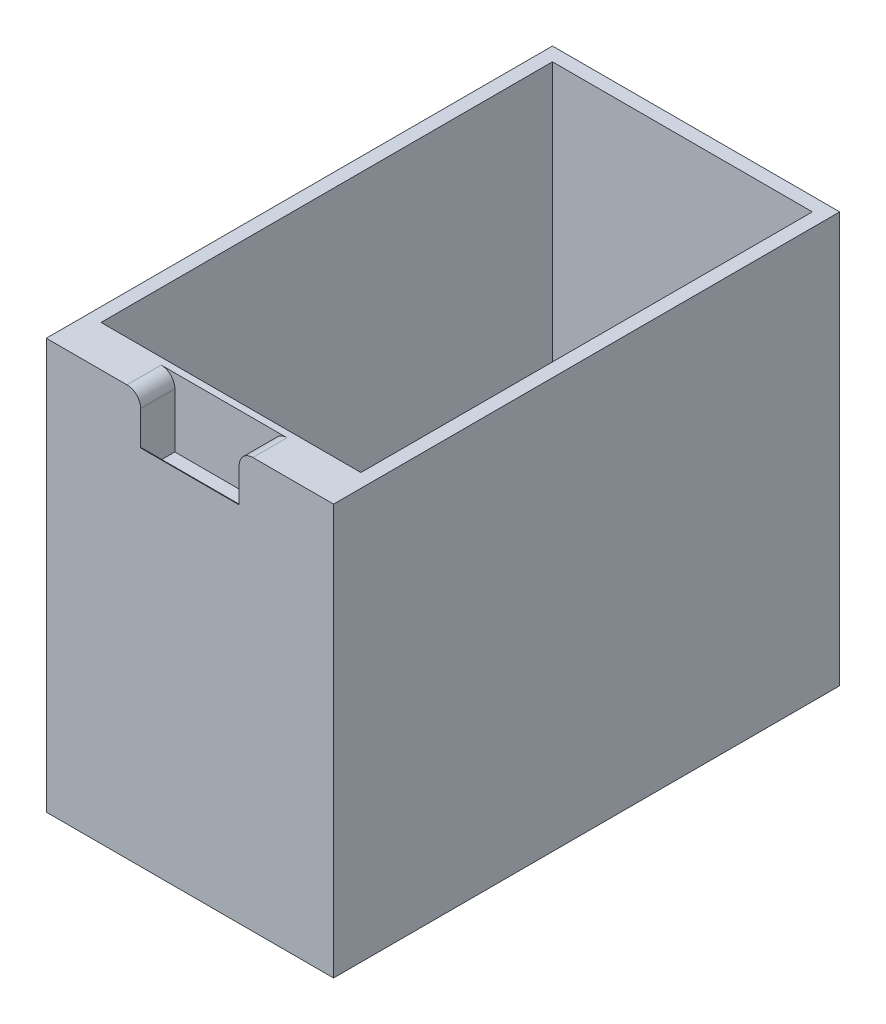
ISO-10303-21;
HEADER;
FILE_DESCRIPTION(('STEP AP214'),'2;1');
FILE_NAME('part.step','',(''),(''),'','','');
FILE_SCHEMA(('AUTOMOTIVE_DESIGN { 1 0 10303 214 1 1 1 1 }'));
ENDSEC;
DATA;
#1=APPLICATION_CONTEXT('core data for automotive mechanical design processes');
#2=APPLICATION_PROTOCOL_DEFINITION('international standard','automotive_design',2000,#1);
#3=PRODUCT_CONTEXT('',#1,'mechanical');
#4=PRODUCT('Part','Part','',(#3));
#5=PRODUCT_RELATED_PRODUCT_CATEGORY('part','',(#4));
#6=PRODUCT_DEFINITION_FORMATION('','',#4);
#7=PRODUCT_DEFINITION_CONTEXT('part definition',#1,'design');
#8=PRODUCT_DEFINITION('design','',#6,#7);
#9=PRODUCT_DEFINITION_SHAPE('','',#8);
#10=(LENGTH_UNIT() NAMED_UNIT(*) SI_UNIT(.MILLI.,.METRE.));
#11=(NAMED_UNIT(*) PLANE_ANGLE_UNIT() SI_UNIT($,.RADIAN.));
#12=(NAMED_UNIT(*) SI_UNIT($,.STERADIAN.) SOLID_ANGLE_UNIT());
#13=UNCERTAINTY_MEASURE_WITH_UNIT(LENGTH_MEASURE(1.E-05),#10,'distance_accuracy_value','');
#14=(GEOMETRIC_REPRESENTATION_CONTEXT(3) GLOBAL_UNCERTAINTY_ASSIGNED_CONTEXT((#13)) GLOBAL_UNIT_ASSIGNED_CONTEXT((#10,
#11,#12)) REPRESENTATION_CONTEXT('',''));
#15=CARTESIAN_POINT('',(0.,0.,0.));
#16=DIRECTION('',(0.,0.,1.));
#17=DIRECTION('',(1.,0.,0.));
#18=AXIS2_PLACEMENT_3D('',#15,#16,#17);
#19=CARTESIAN_POINT('',(-113.883179231863,42.5526315789474,-370.));
#20=DIRECTION('',(-1.,0.,0.));
#21=DIRECTION('',(0.,-1.,0.));
#22=AXIS2_PLACEMENT_3D('',#19,#20,#21);
#23=PLANE('',#22);
#24=DIRECTION('',(0.,-1.,0.));
#25=VECTOR('',#24,1.);
#26=CARTESIAN_POINT('',(-113.883179231863,42.5526315789474,0.));
#27=LINE('',#26,#25);
#28=CARTESIAN_POINT('',(-113.883179231863,42.5526315789474,0.));
#29=VERTEX_POINT('',#28);
#30=CARTESIAN_POINT('',(-113.883179231863,-257.447368421053,0.));
#31=VERTEX_POINT('',#30);
#32=EDGE_CURVE('E215',#29,#31,#27,.T.);
#33=ORIENTED_EDGE('',*,*,#32,.F.);
#34=DIRECTION('',(0.,0.,1.));
#35=VECTOR('',#34,1.);
#36=CARTESIAN_POINT('',(-113.883179231863,42.5526315789474,-370.));
#37=LINE('',#36,#35);
#38=CARTESIAN_POINT('',(-113.883179231863,42.5526315789474,-370.));
#39=VERTEX_POINT('',#38);
#40=EDGE_CURVE('E247',#39,#29,#37,.T.);
#41=ORIENTED_EDGE('',*,*,#40,.F.);
#42=DIRECTION('',(0.,-1.,0.));
#43=VECTOR('',#42,1.);
#44=CARTESIAN_POINT('',(-113.883179231863,42.5526315789474,-370.));
#45=LINE('',#44,#43);
#46=CARTESIAN_POINT('',(-113.883179231863,-257.447368421053,-370.));
#47=VERTEX_POINT('',#46);
#48=EDGE_CURVE('E222',#39,#47,#45,.T.);
#49=ORIENTED_EDGE('',*,*,#48,.T.);
#50=DIRECTION('',(0.,0.,1.));
#51=VECTOR('',#50,1.);
#52=CARTESIAN_POINT('',(-113.883179231863,-257.447368421053,-370.));
#53=LINE('',#52,#51);
#54=EDGE_CURVE('E235',#47,#31,#53,.T.);
#55=ORIENTED_EDGE('',*,*,#54,.T.);
#56=EDGE_LOOP('',(#33,#41,#49,#55));
#57=FACE_BOUND('',#56,.T.);
#58=ADVANCED_FACE('F33',(#57),#23,.T.);
#59=CARTESIAN_POINT('',(-113.883179231863,42.5526315789474,-370.));
#60=DIRECTION('',(0.,1.,0.));
#61=DIRECTION('',(0.,0.,1.));
#62=AXIS2_PLACEMENT_3D('',#59,#60,#61);
#63=PLANE('',#62);
#64=DIRECTION('',(-1.,0.,0.));
#65=VECTOR('',#64,1.);
#66=CARTESIAN_POINT('',(-113.883179231863,42.5526315789474,0.));
#67=LINE('',#66,#65);
#68=CARTESIAN_POINT('',(-54.8831792318634,42.5526315789474,0.));
#69=VERTEX_POINT('',#68);
#70=EDGE_CURVE('E244',#69,#29,#67,.T.);
#71=ORIENTED_EDGE('',*,*,#70,.F.);
#72=DIRECTION('',(0.,0.,1.));
#73=VECTOR('',#72,1.);
#74=CARTESIAN_POINT('',(-54.8831792318634,42.5526315789474,-25.));
#75=LINE('',#74,#73);
#76=CARTESIAN_POINT('',(-54.8831792318634,42.5526315789474,-25.));
#77=VERTEX_POINT('',#76);
#78=EDGE_CURVE('E267',#69,#77,#75,.F.);
#79=ORIENTED_EDGE('',*,*,#78,.T.);
#80=DIRECTION('',(-1.,0.,0.));
#81=VECTOR('',#80,1.);
#82=CARTESIAN_POINT('',(27.1168207681366,42.5526315789474,-25.));
#83=LINE('',#82,#81);
#84=CARTESIAN_POINT('',(37.1168207681366,42.5526315789474,-25.));
#85=VERTEX_POINT('',#84);
#86=EDGE_CURVE('E179',#85,#77,#83,.T.);
#87=ORIENTED_EDGE('',*,*,#86,.F.);
#88=DIRECTION('',(0.,0.,-1.));
#89=VECTOR('',#88,1.);
#90=CARTESIAN_POINT('',(37.1168207681366,42.5526315789474,0.));
#91=LINE('',#90,#89);
#92=CARTESIAN_POINT('',(37.1168207681366,42.5526315789474,0.));
#93=VERTEX_POINT('',#92);
#94=EDGE_CURVE('E256',#85,#93,#91,.F.);
#95=ORIENTED_EDGE('',*,*,#94,.T.);
#96=CARTESIAN_POINT('',(96.1168207681366,42.5526315789474,0.));
#97=VERTEX_POINT('',#96);
#98=EDGE_CURVE('E226',#97,#93,#67,.T.);
#99=ORIENTED_EDGE('',*,*,#98,.F.);
#100=DIRECTION('',(0.,0.,1.));
#101=VECTOR('',#100,1.);
#102=CARTESIAN_POINT('',(96.1168207681366,42.5526315789474,-370.));
#103=LINE('',#102,#101);
#104=CARTESIAN_POINT('',(96.1168207681366,42.5526315789474,-370.));
#105=VERTEX_POINT('',#104);
#106=EDGE_CURVE('E250',#105,#97,#103,.T.);
#107=ORIENTED_EDGE('',*,*,#106,.F.);
#108=DIRECTION('',(-1.,0.,0.));
#109=VECTOR('',#108,1.);
#110=CARTESIAN_POINT('',(-113.883179231863,42.5526315789474,-370.));
#111=LINE('',#110,#109);
#112=EDGE_CURVE('E232',#105,#39,#111,.T.);
#113=ORIENTED_EDGE('',*,*,#112,.T.);
#114=ORIENTED_EDGE('',*,*,#40,.T.);
#115=EDGE_LOOP('',(#71,#79,#87,#95,#99,#107,#113,#114));
#116=FACE_BOUND('',#115,.T.);
#117=DIRECTION('',(0.,0.,1.));
#118=VECTOR('',#117,1.);
#119=CARTESIAN_POINT('',(-103.883179231863,42.5526315789474,-360.));
#120=LINE('',#119,#118);
#121=CARTESIAN_POINT('',(-103.883179231863,42.5526315789474,-360.));
#122=VERTEX_POINT('',#121);
#123=CARTESIAN_POINT('',(-103.883179231863,42.5526315789474,-30.));
#124=VERTEX_POINT('',#123);
#125=EDGE_CURVE('E185',#122,#124,#120,.T.);
#126=ORIENTED_EDGE('',*,*,#125,.F.);
#127=DIRECTION('',(-1.,0.,0.));
#128=VECTOR('',#127,1.);
#129=CARTESIAN_POINT('',(-103.883179231863,42.5526315789474,-360.));
#130=LINE('',#129,#128);
#131=CARTESIAN_POINT('',(86.1168207681366,42.5526315789474,-360.));
#132=VERTEX_POINT('',#131);
#133=EDGE_CURVE('E194',#132,#122,#130,.T.);
#134=ORIENTED_EDGE('',*,*,#133,.F.);
#135=DIRECTION('',(0.,0.,-1.));
#136=VECTOR('',#135,1.);
#137=CARTESIAN_POINT('',(86.1168207681366,42.5526315789474,-360.));
#138=LINE('',#137,#136);
#139=CARTESIAN_POINT('',(86.1168207681366,42.5526315789474,-30.));
#140=VERTEX_POINT('',#139);
#141=EDGE_CURVE('E208',#140,#132,#138,.T.);
#142=ORIENTED_EDGE('',*,*,#141,.F.);
#143=DIRECTION('',(1.,0.,0.));
#144=VECTOR('',#143,1.);
#145=CARTESIAN_POINT('',(-103.883179231863,42.5526315789474,-30.));
#146=LINE('',#145,#144);
#147=EDGE_CURVE('E205',#124,#140,#146,.T.);
#148=ORIENTED_EDGE('',*,*,#147,.F.);
#149=EDGE_LOOP('',(#126,#134,#142,#148));
#150=FACE_BOUND('',#149,.T.);
#151=ADVANCED_FACE('F288',(#116,#150),#63,.T.);
#152=CARTESIAN_POINT('',(96.1168207681366,42.5526315789474,-370.));
#153=DIRECTION('',(1.,0.,0.));
#154=DIRECTION('',(0.,1.,0.));
#155=AXIS2_PLACEMENT_3D('',#152,#153,#154);
#156=PLANE('',#155);
#157=DIRECTION('',(0.,1.,0.));
#158=VECTOR('',#157,1.);
#159=CARTESIAN_POINT('',(96.1168207681366,42.5526315789474,0.));
#160=LINE('',#159,#158);
#161=CARTESIAN_POINT('',(96.1168207681366,-257.447368421053,0.));
#162=VERTEX_POINT('',#161);
#163=EDGE_CURVE('E241',#162,#97,#160,.T.);
#164=ORIENTED_EDGE('',*,*,#163,.F.);
#165=DIRECTION('',(0.,0.,1.));
#166=VECTOR('',#165,1.);
#167=CARTESIAN_POINT('',(96.1168207681366,-257.447368421053,-370.));
#168=LINE('',#167,#166);
#169=CARTESIAN_POINT('',(96.1168207681366,-257.447368421053,-370.));
#170=VERTEX_POINT('',#169);
#171=EDGE_CURVE('E252',#170,#162,#168,.T.);
#172=ORIENTED_EDGE('',*,*,#171,.F.);
#173=DIRECTION('',(0.,1.,0.));
#174=VECTOR('',#173,1.);
#175=CARTESIAN_POINT('',(96.1168207681366,42.5526315789474,-370.));
#176=LINE('',#175,#174);
#177=EDGE_CURVE('E229',#170,#105,#176,.T.);
#178=ORIENTED_EDGE('',*,*,#177,.T.);
#179=ORIENTED_EDGE('',*,*,#106,.T.);
#180=EDGE_LOOP('',(#164,#172,#178,#179));
#181=FACE_BOUND('',#180,.T.);
#182=ADVANCED_FACE('F302',(#181),#156,.T.);
#183=CARTESIAN_POINT('',(-113.883179231863,-257.447368421053,-370.));
#184=DIRECTION('',(0.,-1.,0.));
#185=DIRECTION('',(0.,0.,-1.));
#186=AXIS2_PLACEMENT_3D('',#183,#184,#185);
#187=PLANE('',#186);
#188=DIRECTION('',(1.,0.,0.));
#189=VECTOR('',#188,1.);
#190=CARTESIAN_POINT('',(-113.883179231863,-257.447368421053,0.));
#191=LINE('',#190,#189);
#192=EDGE_CURVE('E238',#31,#162,#191,.T.);
#193=ORIENTED_EDGE('',*,*,#192,.F.);
#194=ORIENTED_EDGE('',*,*,#54,.F.);
#195=DIRECTION('',(1.,0.,0.));
#196=VECTOR('',#195,1.);
#197=CARTESIAN_POINT('',(-113.883179231863,-257.447368421053,-370.));
#198=LINE('',#197,#196);
#199=EDGE_CURVE('E225',#47,#170,#198,.T.);
#200=ORIENTED_EDGE('',*,*,#199,.T.);
#201=ORIENTED_EDGE('',*,*,#171,.T.);
#202=EDGE_LOOP('',(#193,#194,#200,#201));
#203=FACE_BOUND('',#202,.T.);
#204=ADVANCED_FACE('F298',(#203),#187,.T.);
#205=CARTESIAN_POINT('',(0.,0.,-370.));
#206=DIRECTION('',(0.,0.,1.));
#207=DIRECTION('',(1.,0.,0.));
#208=AXIS2_PLACEMENT_3D('',#205,#206,#207);
#209=PLANE('',#208);
#210=ORIENTED_EDGE('',*,*,#48,.F.);
#211=ORIENTED_EDGE('',*,*,#112,.F.);
#212=ORIENTED_EDGE('',*,*,#177,.F.);
#213=ORIENTED_EDGE('',*,*,#199,.F.);
#214=EDGE_LOOP('',(#210,#211,#212,#213));
#215=FACE_BOUND('',#214,.T.);
#216=ADVANCED_FACE('F322',(#215),#209,.F.);
#217=CARTESIAN_POINT('',(0.,0.,0.));
#218=DIRECTION('',(0.,0.,1.));
#219=DIRECTION('',(1.,0.,0.));
#220=AXIS2_PLACEMENT_3D('',#217,#218,#219);
#221=PLANE('',#220);
#222=DIRECTION('',(0.,1.,0.));
#223=VECTOR('',#222,1.);
#224=CARTESIAN_POINT('',(-44.8831792318634,7.55263157894735,0.));
#225=LINE('',#224,#223);
#226=CARTESIAN_POINT('',(-44.8831792318634,7.55263157894735,0.));
#227=VERTEX_POINT('',#226);
#228=CARTESIAN_POINT('',(-44.8831792318634,32.5526315789474,0.));
#229=VERTEX_POINT('',#228);
#230=EDGE_CURVE('E186',#227,#229,#225,.T.);
#231=ORIENTED_EDGE('',*,*,#230,.T.);
#232=CARTESIAN_POINT('',(-54.8831792318634,32.5526315789474,0.));
#233=DIRECTION('',(0.,0.,1.));
#234=DIRECTION('',(1.,0.,0.));
#235=AXIS2_PLACEMENT_3D('',#232,#233,#234);
#236=CIRCLE('',#235,10.);
#237=EDGE_CURVE('E265',#229,#69,#236,.T.);
#238=ORIENTED_EDGE('',*,*,#237,.T.);
#239=ORIENTED_EDGE('',*,*,#70,.T.);
#240=ORIENTED_EDGE('',*,*,#32,.T.);
#241=ORIENTED_EDGE('',*,*,#192,.T.);
#242=ORIENTED_EDGE('',*,*,#163,.T.);
#243=ORIENTED_EDGE('',*,*,#98,.T.);
#244=CARTESIAN_POINT('',(37.1168207681366,32.5526315789474,0.));
#245=DIRECTION('',(0.,0.,1.));
#246=DIRECTION('',(1.,0.,0.));
#247=AXIS2_PLACEMENT_3D('',#244,#245,#246);
#248=CIRCLE('',#247,10.);
#249=CARTESIAN_POINT('',(27.1168207681366,32.5526315789474,0.));
#250=VERTEX_POINT('',#249);
#251=EDGE_CURVE('E258',#93,#250,#248,.T.);
#252=ORIENTED_EDGE('',*,*,#251,.T.);
#253=DIRECTION('',(0.,1.,0.));
#254=VECTOR('',#253,1.);
#255=CARTESIAN_POINT('',(27.1168207681366,7.55263157894735,0.));
#256=LINE('',#255,#254);
#257=CARTESIAN_POINT('',(27.1168207681366,7.55263157894735,0.));
#258=VERTEX_POINT('',#257);
#259=EDGE_CURVE('E183',#258,#250,#256,.T.);
#260=ORIENTED_EDGE('',*,*,#259,.F.);
#261=DIRECTION('',(1.,0.,0.));
#262=VECTOR('',#261,1.);
#263=CARTESIAN_POINT('',(27.1168207681366,7.55263157894735,0.));
#264=LINE('',#263,#262);
#265=EDGE_CURVE('E158',#227,#258,#264,.T.);
#266=ORIENTED_EDGE('',*,*,#265,.F.);
#267=EDGE_LOOP('',(#231,#238,#239,#240,#241,#242,#243,#252,#260,#266));
#268=FACE_BOUND('',#267,.T.);
#269=ADVANCED_FACE('F276',(#268),#221,.T.);
#270=CARTESIAN_POINT('',(-103.883179231863,-237.447368421053,-360.));
#271=DIRECTION('',(-1.,0.,0.));
#272=DIRECTION('',(0.,0.,1.));
#273=AXIS2_PLACEMENT_3D('',#270,#271,#272);
#274=PLANE('',#273);
#275=ORIENTED_EDGE('',*,*,#125,.T.);
#276=DIRECTION('',(0.,1.,0.));
#277=VECTOR('',#276,1.);
#278=CARTESIAN_POINT('',(-103.883179231863,-237.447368421053,-30.));
#279=LINE('',#278,#277);
#280=CARTESIAN_POINT('',(-103.883179231863,-237.447368421053,-30.));
#281=VERTEX_POINT('',#280);
#282=EDGE_CURVE('E203',#281,#124,#279,.T.);
#283=ORIENTED_EDGE('',*,*,#282,.F.);
#284=DIRECTION('',(0.,0.,1.));
#285=VECTOR('',#284,1.);
#286=CARTESIAN_POINT('',(-103.883179231863,-237.447368421053,-360.));
#287=LINE('',#286,#285);
#288=CARTESIAN_POINT('',(-103.883179231863,-237.447368421053,-360.));
#289=VERTEX_POINT('',#288);
#290=EDGE_CURVE('E190',#289,#281,#287,.T.);
#291=ORIENTED_EDGE('',*,*,#290,.F.);
#292=DIRECTION('',(0.,1.,0.));
#293=VECTOR('',#292,1.);
#294=CARTESIAN_POINT('',(-103.883179231863,-237.447368421053,-360.));
#295=LINE('',#294,#293);
#296=EDGE_CURVE('E213',#289,#122,#295,.T.);
#297=ORIENTED_EDGE('',*,*,#296,.T.);
#298=EDGE_LOOP('',(#275,#283,#291,#297));
#299=FACE_BOUND('',#298,.T.);
#300=ADVANCED_FACE('F327',(#299),#274,.F.);
#301=CARTESIAN_POINT('',(-103.883179231863,-237.447368421053,-360.));
#302=DIRECTION('',(0.,0.,-1.));
#303=DIRECTION('',(-1.,0.,0.));
#304=AXIS2_PLACEMENT_3D('',#301,#302,#303);
#305=PLANE('',#304);
#306=ORIENTED_EDGE('',*,*,#133,.T.);
#307=ORIENTED_EDGE('',*,*,#296,.F.);
#308=DIRECTION('',(-1.,0.,0.));
#309=VECTOR('',#308,1.);
#310=CARTESIAN_POINT('',(-103.883179231863,-237.447368421053,-360.));
#311=LINE('',#310,#309);
#312=CARTESIAN_POINT('',(86.1168207681366,-237.447368421053,-360.));
#313=VERTEX_POINT('',#312);
#314=EDGE_CURVE('E200',#313,#289,#311,.T.);
#315=ORIENTED_EDGE('',*,*,#314,.F.);
#316=DIRECTION('',(0.,1.,0.));
#317=VECTOR('',#316,1.);
#318=CARTESIAN_POINT('',(86.1168207681366,-237.447368421053,-360.));
#319=LINE('',#318,#317);
#320=EDGE_CURVE('E216',#313,#132,#319,.T.);
#321=ORIENTED_EDGE('',*,*,#320,.T.);
#322=EDGE_LOOP('',(#306,#307,#315,#321));
#323=FACE_BOUND('',#322,.T.);
#324=ADVANCED_FACE('F333',(#323),#305,.F.);
#325=CARTESIAN_POINT('',(86.1168207681366,-237.447368421053,-360.));
#326=DIRECTION('',(1.,0.,0.));
#327=DIRECTION('',(0.,0.,-1.));
#328=AXIS2_PLACEMENT_3D('',#325,#326,#327);
#329=PLANE('',#328);
#330=ORIENTED_EDGE('',*,*,#141,.T.);
#331=ORIENTED_EDGE('',*,*,#320,.F.);
#332=DIRECTION('',(0.,0.,-1.));
#333=VECTOR('',#332,1.);
#334=CARTESIAN_POINT('',(86.1168207681366,-237.447368421053,-360.));
#335=LINE('',#334,#333);
#336=CARTESIAN_POINT('',(86.1168207681366,-237.447368421053,-30.));
#337=VERTEX_POINT('',#336);
#338=EDGE_CURVE('E197',#337,#313,#335,.T.);
#339=ORIENTED_EDGE('',*,*,#338,.F.);
#340=DIRECTION('',(0.,1.,0.));
#341=VECTOR('',#340,1.);
#342=CARTESIAN_POINT('',(86.1168207681366,-237.447368421053,-30.));
#343=LINE('',#342,#341);
#344=EDGE_CURVE('E218',#337,#140,#343,.T.);
#345=ORIENTED_EDGE('',*,*,#344,.T.);
#346=EDGE_LOOP('',(#330,#331,#339,#345));
#347=FACE_BOUND('',#346,.T.);
#348=ADVANCED_FACE('F339',(#347),#329,.F.);
#349=CARTESIAN_POINT('',(-103.883179231863,-237.447368421053,-30.));
#350=DIRECTION('',(0.,0.,1.));
#351=DIRECTION('',(1.,0.,0.));
#352=AXIS2_PLACEMENT_3D('',#349,#350,#351);
#353=PLANE('',#352);
#354=ORIENTED_EDGE('',*,*,#147,.T.);
#355=ORIENTED_EDGE('',*,*,#344,.F.);
#356=DIRECTION('',(1.,0.,0.));
#357=VECTOR('',#356,1.);
#358=CARTESIAN_POINT('',(-103.883179231863,-237.447368421053,-30.));
#359=LINE('',#358,#357);
#360=EDGE_CURVE('E193',#281,#337,#359,.T.);
#361=ORIENTED_EDGE('',*,*,#360,.F.);
#362=ORIENTED_EDGE('',*,*,#282,.T.);
#363=EDGE_LOOP('',(#354,#355,#361,#362));
#364=FACE_BOUND('',#363,.T.);
#365=ADVANCED_FACE('F335',(#364),#353,.F.);
#366=CARTESIAN_POINT('',(0.,-237.447368421053,0.));
#367=DIRECTION('',(0.,1.,0.));
#368=DIRECTION('',(0.,0.,1.));
#369=AXIS2_PLACEMENT_3D('',#366,#367,#368);
#370=PLANE('',#369);
#371=ORIENTED_EDGE('',*,*,#290,.T.);
#372=ORIENTED_EDGE('',*,*,#360,.T.);
#373=ORIENTED_EDGE('',*,*,#338,.T.);
#374=ORIENTED_EDGE('',*,*,#314,.T.);
#375=EDGE_LOOP('',(#371,#372,#373,#374));
#376=FACE_BOUND('',#375,.T.);
#377=ADVANCED_FACE('F338',(#376),#370,.T.);
#378=CARTESIAN_POINT('',(27.1168207681366,7.55263157894735,0.));
#379=DIRECTION('',(1.,0.,0.));
#380=DIRECTION('',(0.,0.,-1.));
#381=AXIS2_PLACEMENT_3D('',#378,#379,#380);
#382=PLANE('',#381);
#383=ORIENTED_EDGE('',*,*,#259,.T.);
#384=DIRECTION('',(0.,0.,-1.));
#385=VECTOR('',#384,1.);
#386=CARTESIAN_POINT('',(27.1168207681366,32.5526315789474,-25.));
#387=LINE('',#386,#385);
#388=CARTESIAN_POINT('',(27.1168207681366,32.5526315789474,-25.));
#389=VERTEX_POINT('',#388);
#390=EDGE_CURVE('E154',#250,#389,#387,.T.);
#391=ORIENTED_EDGE('',*,*,#390,.T.);
#392=DIRECTION('',(0.,1.,0.));
#393=VECTOR('',#392,1.);
#394=CARTESIAN_POINT('',(27.1168207681366,7.55263157894735,-25.));
#395=LINE('',#394,#393);
#396=CARTESIAN_POINT('',(27.1168207681366,-7.44736842105265,-25.));
#397=VERTEX_POINT('',#396);
#398=EDGE_CURVE('E145',#397,#389,#395,.T.);
#399=ORIENTED_EDGE('',*,*,#398,.F.);
#400=DIRECTION('',(0.,0.,-1.));
#401=VECTOR('',#400,1.);
#402=CARTESIAN_POINT('',(27.1168207681366,-7.44736842105265,-5.));
#403=LINE('',#402,#401);
#404=CARTESIAN_POINT('',(27.1168207681366,-7.44736842105265,-5.));
#405=VERTEX_POINT('',#404);
#406=EDGE_CURVE('E151',#405,#397,#403,.T.);
#407=ORIENTED_EDGE('',*,*,#406,.F.);
#408=DIRECTION('',(0.,1.,0.));
#409=VECTOR('',#408,1.);
#410=CARTESIAN_POINT('',(27.1168207681366,-7.44736842105265,-5.));
#411=LINE('',#410,#409);
#412=CARTESIAN_POINT('',(27.1168207681366,-1.10762245889703,-5.));
#413=VERTEX_POINT('',#412);
#414=EDGE_CURVE('E177',#405,#413,#411,.T.);
#415=ORIENTED_EDGE('',*,*,#414,.T.);
#416=CARTESIAN_POINT('',(27.1168207681366,-1.10762245889703,5.));
#417=DIRECTION('',(1.,0.,0.));
#418=DIRECTION('',(0.,0.,-1.));
#419=AXIS2_PLACEMENT_3D('',#416,#417,#418);
#420=CIRCLE('',#419,10.);
#421=EDGE_CURVE('E41',#413,#258,#420,.T.);
#422=ORIENTED_EDGE('',*,*,#421,.T.);
#423=EDGE_LOOP('',(#383,#391,#399,#407,#415,#422));
#424=FACE_BOUND('',#423,.T.);
#425=ADVANCED_FACE('F148',(#424),#382,.F.);
#426=CARTESIAN_POINT('',(-44.8831792318634,7.55263157894735,0.));
#427=DIRECTION('',(-1.,0.,0.));
#428=DIRECTION('',(0.,0.,1.));
#429=AXIS2_PLACEMENT_3D('',#426,#427,#428);
#430=PLANE('',#429);
#431=DIRECTION('',(0.,1.,0.));
#432=VECTOR('',#431,1.);
#433=CARTESIAN_POINT('',(-44.8831792318634,7.55263157894735,-25.));
#434=LINE('',#433,#432);
#435=CARTESIAN_POINT('',(-44.8831792318634,-7.44736842105265,-25.));
#436=VERTEX_POINT('',#435);
#437=CARTESIAN_POINT('',(-44.8831792318634,32.5526315789474,-25.));
#438=VERTEX_POINT('',#437);
#439=EDGE_CURVE('E157',#436,#438,#434,.T.);
#440=ORIENTED_EDGE('',*,*,#439,.T.);
#441=DIRECTION('',(0.,0.,1.));
#442=VECTOR('',#441,1.);
#443=CARTESIAN_POINT('',(-44.8831792318634,32.5526315789474,0.));
#444=LINE('',#443,#442);
#445=EDGE_CURVE('E262',#438,#229,#444,.T.);
#446=ORIENTED_EDGE('',*,*,#445,.T.);
#447=ORIENTED_EDGE('',*,*,#230,.F.);
#448=CARTESIAN_POINT('',(-44.8831792318634,-1.10762245889703,5.));
#449=DIRECTION('',(-1.,0.,0.));
#450=DIRECTION('',(0.,0.,1.));
#451=AXIS2_PLACEMENT_3D('',#448,#449,#450);
#452=CIRCLE('',#451,10.);
#453=CARTESIAN_POINT('',(-44.8831792318634,-1.10762245889703,-4.99999999999999));
#454=VERTEX_POINT('',#453);
#455=EDGE_CURVE('E11',#227,#454,#452,.T.);
#456=ORIENTED_EDGE('',*,*,#455,.T.);
#457=DIRECTION('',(0.,1.,0.));
#458=VECTOR('',#457,1.);
#459=CARTESIAN_POINT('',(-44.8831792318634,-7.44736842105265,-4.99999999999999));
#460=LINE('',#459,#458);
#461=CARTESIAN_POINT('',(-44.8831792318634,-7.44736842105265,-4.99999999999999));
#462=VERTEX_POINT('',#461);
#463=EDGE_CURVE('E176',#462,#454,#460,.T.);
#464=ORIENTED_EDGE('',*,*,#463,.F.);
#465=DIRECTION('',(0.,0.,1.));
#466=VECTOR('',#465,1.);
#467=CARTESIAN_POINT('',(-44.8831792318634,-7.44736842105265,-4.99999999999999));
#468=LINE('',#467,#466);
#469=EDGE_CURVE('E167',#436,#462,#468,.T.);
#470=ORIENTED_EDGE('',*,*,#469,.F.);
#471=EDGE_LOOP('',(#440,#446,#447,#456,#464,#470));
#472=FACE_BOUND('',#471,.T.);
#473=ADVANCED_FACE('F280',(#472),#430,.F.);
#474=CARTESIAN_POINT('',(27.1168207681366,7.55263157894735,-25.));
#475=DIRECTION('',(0.,0.,-1.));
#476=DIRECTION('',(-1.,0.,0.));
#477=AXIS2_PLACEMENT_3D('',#474,#475,#476);
#478=PLANE('',#477);
#479=ORIENTED_EDGE('',*,*,#86,.T.);
#480=CARTESIAN_POINT('',(-54.8831792318634,32.5526315789474,-25.));
#481=DIRECTION('',(0.,0.,-1.));
#482=DIRECTION('',(-1.,0.,0.));
#483=AXIS2_PLACEMENT_3D('',#480,#481,#482);
#484=CIRCLE('',#483,10.);
#485=EDGE_CURVE('E270',#77,#438,#484,.T.);
#486=ORIENTED_EDGE('',*,*,#485,.T.);
#487=ORIENTED_EDGE('',*,*,#439,.F.);
#488=DIRECTION('',(-1.,0.,0.));
#489=VECTOR('',#488,1.);
#490=CARTESIAN_POINT('',(27.1168207681366,-7.44736842105265,-25.));
#491=LINE('',#490,#489);
#492=EDGE_CURVE('E161',#397,#436,#491,.T.);
#493=ORIENTED_EDGE('',*,*,#492,.F.);
#494=ORIENTED_EDGE('',*,*,#398,.T.);
#495=CARTESIAN_POINT('',(37.1168207681366,32.5526315789474,-25.));
#496=DIRECTION('',(0.,0.,-1.));
#497=DIRECTION('',(-1.,0.,0.));
#498=AXIS2_PLACEMENT_3D('',#495,#496,#497);
#499=CIRCLE('',#498,10.);
#500=EDGE_CURVE('E260',#389,#85,#499,.T.);
#501=ORIENTED_EDGE('',*,*,#500,.T.);
#502=EDGE_LOOP('',(#479,#486,#487,#493,#494,#501));
#503=FACE_BOUND('',#502,.T.);
#504=ADVANCED_FACE('F162',(#503),#478,.F.);
#505=CARTESIAN_POINT('',(27.1168207681366,-7.44736842105265,-5.));
#506=DIRECTION('',(0.,0.,1.));
#507=DIRECTION('',(1.,0.,0.));
#508=AXIS2_PLACEMENT_3D('',#505,#506,#507);
#509=PLANE('',#508);
#510=ORIENTED_EDGE('',*,*,#463,.T.);
#511=DIRECTION('',(1.,0.,0.));
#512=VECTOR('',#511,1.);
#513=CARTESIAN_POINT('',(27.1168207681366,-1.10762245889703,-5.));
#514=LINE('',#513,#512);
#515=EDGE_CURVE('E272',#454,#413,#514,.T.);
#516=ORIENTED_EDGE('',*,*,#515,.T.);
#517=ORIENTED_EDGE('',*,*,#414,.F.);
#518=DIRECTION('',(1.,0.,0.));
#519=VECTOR('',#518,1.);
#520=CARTESIAN_POINT('',(27.1168207681366,-7.44736842105265,-5.));
#521=LINE('',#520,#519);
#522=EDGE_CURVE('E171',#462,#405,#521,.T.);
#523=ORIENTED_EDGE('',*,*,#522,.F.);
#524=EDGE_LOOP('',(#510,#516,#517,#523));
#525=FACE_BOUND('',#524,.T.);
#526=ADVANCED_FACE('F279',(#525),#509,.F.);
#527=CARTESIAN_POINT('',(0.,-7.44736842105265,0.));
#528=DIRECTION('',(0.,1.,0.));
#529=DIRECTION('',(0.,0.,1.));
#530=AXIS2_PLACEMENT_3D('',#527,#528,#529);
#531=PLANE('',#530);
#532=ORIENTED_EDGE('',*,*,#406,.T.);
#533=ORIENTED_EDGE('',*,*,#492,.T.);
#534=ORIENTED_EDGE('',*,*,#469,.T.);
#535=ORIENTED_EDGE('',*,*,#522,.T.);
#536=EDGE_LOOP('',(#532,#533,#534,#535));
#537=FACE_BOUND('',#536,.T.);
#538=ADVANCED_FACE('F169',(#537),#531,.T.);
#539=CARTESIAN_POINT('',(37.1168207681366,32.5526315789474,0.));
#540=DIRECTION('',(0.,0.,1.));
#541=DIRECTION('',(1.,0.,0.));
#542=AXIS2_PLACEMENT_3D('',#539,#540,#541);
#543=CYLINDRICAL_SURFACE('',#542,10.);
#544=ORIENTED_EDGE('',*,*,#251,.F.);
#545=ORIENTED_EDGE('',*,*,#94,.F.);
#546=ORIENTED_EDGE('',*,*,#500,.F.);
#547=ORIENTED_EDGE('',*,*,#390,.F.);
#548=EDGE_LOOP('',(#544,#545,#546,#547));
#549=FACE_BOUND('',#548,.T.);
#550=ADVANCED_FACE('F305',(#549),#543,.T.);
#551=CARTESIAN_POINT('',(-54.8831792318634,32.5526315789474,0.));
#552=DIRECTION('',(0.,0.,-1.));
#553=DIRECTION('',(-1.,0.,0.));
#554=AXIS2_PLACEMENT_3D('',#551,#552,#553);
#555=CYLINDRICAL_SURFACE('',#554,10.);
#556=ORIENTED_EDGE('',*,*,#485,.F.);
#557=ORIENTED_EDGE('',*,*,#78,.F.);
#558=ORIENTED_EDGE('',*,*,#237,.F.);
#559=ORIENTED_EDGE('',*,*,#445,.F.);
#560=EDGE_LOOP('',(#556,#557,#558,#559));
#561=FACE_BOUND('',#560,.T.);
#562=ADVANCED_FACE('F284',(#561),#555,.T.);
#563=CARTESIAN_POINT('',(0.,-1.10762245889703,5.));
#564=DIRECTION('',(1.,0.,0.));
#565=DIRECTION('',(0.,0.,-1.));
#566=AXIS2_PLACEMENT_3D('',#563,#564,#565);
#567=CYLINDRICAL_SURFACE('',#566,10.);
#568=ORIENTED_EDGE('',*,*,#455,.F.);
#569=ORIENTED_EDGE('',*,*,#265,.T.);
#570=ORIENTED_EDGE('',*,*,#421,.F.);
#571=ORIENTED_EDGE('',*,*,#515,.F.);
#572=EDGE_LOOP('',(#568,#569,#570,#571));
#573=FACE_BOUND('',#572,.T.);
#574=ADVANCED_FACE('F35',(#573),#567,.T.);
#575=CLOSED_SHELL('',(#58,#151,#182,#204,#216,#269,#300,#324,#348,#365,#377,#425,#473,#504,#526,
#538,#550,#562,#574));
#576=MANIFOLD_SOLID_BREP('B2',#575);
#577=ADVANCED_BREP_SHAPE_REPRESENTATION('',(#18,#576),#14);
#578=SHAPE_DEFINITION_REPRESENTATION(#9,#577);
ENDSEC;
END-ISO-10303-21;
